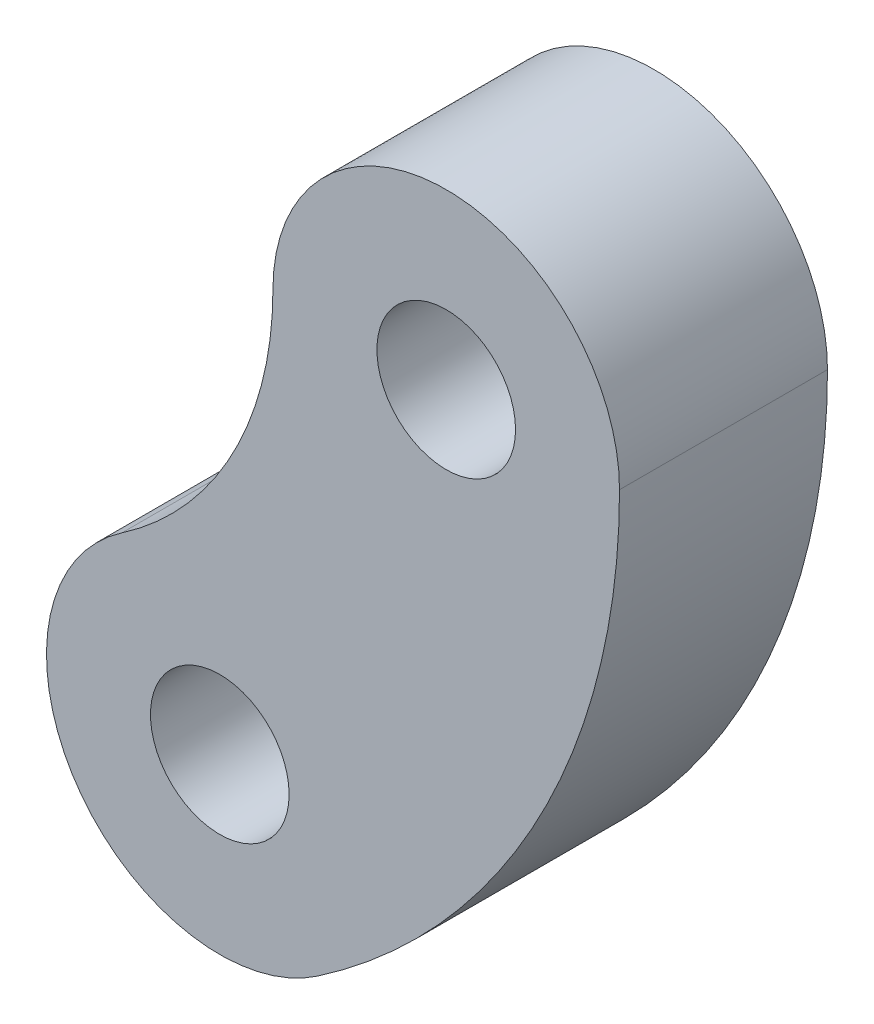
ISO-10303-21;
HEADER;
FILE_DESCRIPTION(('STEP AP214'),'2;1');
FILE_NAME('part.step','',(''),(''),'','','');
FILE_SCHEMA(('AUTOMOTIVE_DESIGN { 1 0 10303 214 1 1 1 1 }'));
ENDSEC;
DATA;
#1=APPLICATION_CONTEXT('core data for automotive mechanical design processes');
#2=APPLICATION_PROTOCOL_DEFINITION('international standard','automotive_design',2000,#1);
#3=PRODUCT_CONTEXT('',#1,'mechanical');
#4=PRODUCT('Part','Part','',(#3));
#5=PRODUCT_RELATED_PRODUCT_CATEGORY('part','',(#4));
#6=PRODUCT_DEFINITION_FORMATION('','',#4);
#7=PRODUCT_DEFINITION_CONTEXT('part definition',#1,'design');
#8=PRODUCT_DEFINITION('design','',#6,#7);
#9=PRODUCT_DEFINITION_SHAPE('','',#8);
#10=(LENGTH_UNIT() NAMED_UNIT(*) SI_UNIT(.MILLI.,.METRE.));
#11=(NAMED_UNIT(*) PLANE_ANGLE_UNIT() SI_UNIT($,.RADIAN.));
#12=(NAMED_UNIT(*) SI_UNIT($,.STERADIAN.) SOLID_ANGLE_UNIT());
#13=UNCERTAINTY_MEASURE_WITH_UNIT(LENGTH_MEASURE(1.E-05),#10,'distance_accuracy_value','');
#14=(GEOMETRIC_REPRESENTATION_CONTEXT(3) GLOBAL_UNCERTAINTY_ASSIGNED_CONTEXT((#13)) GLOBAL_UNIT_ASSIGNED_CONTEXT((#10,
#11,#12)) REPRESENTATION_CONTEXT('',''));
#15=CARTESIAN_POINT('',(0.,0.,0.));
#16=DIRECTION('',(0.,0.,1.));
#17=DIRECTION('',(1.,0.,0.));
#18=AXIS2_PLACEMENT_3D('',#15,#16,#17);
#19=CARTESIAN_POINT('',(3.75,0.,1.5));
#20=DIRECTION('',(0.,0.,1.));
#21=DIRECTION('',(1.,0.,0.));
#22=AXIS2_PLACEMENT_3D('',#19,#20,#21);
#23=PLANE('',#22);
#24=CARTESIAN_POINT('',(4.23333333333333,-6.19103294199675,1.5));
#25=DIRECTION('',(0.,0.,1.));
#26=DIRECTION('',(1.,0.,0.));
#27=AXIS2_PLACEMENT_3D('',#24,#25,#26);
#28=CIRCLE('',#27,1.);
#29=CARTESIAN_POINT('',(5.23333333333333,-6.19103294199675,1.5));
#30=VERTEX_POINT('',#29);
#31=EDGE_CURVE('E100',#30,#30,#28,.T.);
#32=ORIENTED_EDGE('',*,*,#31,.F.);
#33=EDGE_LOOP('',(#32));
#34=FACE_BOUND('',#33,.T.);
#35=CARTESIAN_POINT('',(7.5,0.,1.5));
#36=DIRECTION('',(0.,0.,1.));
#37=DIRECTION('',(1.,0.,0.));
#38=AXIS2_PLACEMENT_3D('',#35,#36,#37);
#39=CIRCLE('',#38,2.5);
#40=CARTESIAN_POINT('',(10.,0.,1.5));
#41=VERTEX_POINT('',#40);
#42=CARTESIAN_POINT('',(5.,0.,1.5));
#43=VERTEX_POINT('',#42);
#44=EDGE_CURVE('E85',#41,#43,#39,.T.);
#45=ORIENTED_EDGE('',*,*,#44,.T.);
#46=CARTESIAN_POINT('',(0.,0.,1.5));
#47=DIRECTION('',(0.,0.,-1.));
#48=DIRECTION('',(1.,0.,0.));
#49=AXIS2_PLACEMENT_3D('',#46,#47,#48);
#50=CIRCLE('',#49,5.);
#51=CARTESIAN_POINT('',(2.82222222222222,-4.1273552946645,1.5));
#52=VERTEX_POINT('',#51);
#53=EDGE_CURVE('E80',#43,#52,#50,.T.);
#54=ORIENTED_EDGE('',*,*,#53,.T.);
#55=CARTESIAN_POINT('',(4.23333333333333,-6.19103294199675,1.5));
#56=DIRECTION('',(0.,0.,1.));
#57=DIRECTION('',(1.,0.,0.));
#58=AXIS2_PLACEMENT_3D('',#55,#56,#57);
#59=CIRCLE('',#58,2.5);
#60=CARTESIAN_POINT('',(5.64444444444445,-8.25471058932899,1.5));
#61=VERTEX_POINT('',#60);
#62=EDGE_CURVE('E83',#52,#61,#59,.T.);
#63=ORIENTED_EDGE('',*,*,#62,.T.);
#64=CARTESIAN_POINT('',(0.,0.,1.5));
#65=DIRECTION('',(0.,0.,1.));
#66=DIRECTION('',(1.,0.,0.));
#67=AXIS2_PLACEMENT_3D('',#64,#65,#66);
#68=CIRCLE('',#67,10.);
#69=EDGE_CURVE('E50',#61,#41,#68,.T.);
#70=ORIENTED_EDGE('',*,*,#69,.T.);
#71=EDGE_LOOP('',(#45,#54,#63,#70));
#72=FACE_BOUND('',#71,.T.);
#73=CARTESIAN_POINT('',(7.5,0.,1.5));
#74=DIRECTION('',(0.,0.,1.));
#75=DIRECTION('',(1.,0.,0.));
#76=AXIS2_PLACEMENT_3D('',#73,#74,#75);
#77=CIRCLE('',#76,1.);
#78=CARTESIAN_POINT('',(8.5,0.,1.5));
#79=VERTEX_POINT('',#78);
#80=EDGE_CURVE('E115',#79,#79,#77,.T.);
#81=ORIENTED_EDGE('',*,*,#80,.F.);
#82=EDGE_LOOP('',(#81));
#83=FACE_BOUND('',#82,.T.);
#84=ADVANCED_FACE('F33',(#34,#72,#83),#23,.T.);
#85=CARTESIAN_POINT('',(3.75,0.,-1.5));
#86=DIRECTION('',(0.,0.,1.));
#87=DIRECTION('',(1.,0.,0.));
#88=AXIS2_PLACEMENT_3D('',#85,#86,#87);
#89=PLANE('',#88);
#90=CARTESIAN_POINT('',(7.5,0.,-1.5));
#91=DIRECTION('',(0.,0.,1.));
#92=DIRECTION('',(1.,0.,0.));
#93=AXIS2_PLACEMENT_3D('',#90,#91,#92);
#94=CIRCLE('',#93,2.5);
#95=CARTESIAN_POINT('',(10.,0.,-1.5));
#96=VERTEX_POINT('',#95);
#97=CARTESIAN_POINT('',(5.,0.,-1.5));
#98=VERTEX_POINT('',#97);
#99=EDGE_CURVE('E97',#96,#98,#94,.T.);
#100=ORIENTED_EDGE('',*,*,#99,.F.);
#101=CARTESIAN_POINT('',(0.,0.,-1.5));
#102=DIRECTION('',(0.,0.,1.));
#103=DIRECTION('',(1.,0.,0.));
#104=AXIS2_PLACEMENT_3D('',#101,#102,#103);
#105=CIRCLE('',#104,10.);
#106=CARTESIAN_POINT('',(5.64444444444445,-8.25471058932899,-1.5));
#107=VERTEX_POINT('',#106);
#108=EDGE_CURVE('E73',#107,#96,#105,.T.);
#109=ORIENTED_EDGE('',*,*,#108,.F.);
#110=CARTESIAN_POINT('',(4.23333333333333,-6.19103294199675,-1.5));
#111=DIRECTION('',(0.,0.,1.));
#112=DIRECTION('',(1.,0.,0.));
#113=AXIS2_PLACEMENT_3D('',#110,#111,#112);
#114=CIRCLE('',#113,2.5);
#115=CARTESIAN_POINT('',(2.82222222222222,-4.1273552946645,-1.5));
#116=VERTEX_POINT('',#115);
#117=EDGE_CURVE('E67',#116,#107,#114,.T.);
#118=ORIENTED_EDGE('',*,*,#117,.F.);
#119=CARTESIAN_POINT('',(0.,0.,-1.5));
#120=DIRECTION('',(0.,0.,-1.));
#121=DIRECTION('',(1.,0.,0.));
#122=AXIS2_PLACEMENT_3D('',#119,#120,#121);
#123=CIRCLE('',#122,5.);
#124=EDGE_CURVE('E89',#98,#116,#123,.T.);
#125=ORIENTED_EDGE('',*,*,#124,.F.);
#126=EDGE_LOOP('',(#100,#109,#118,#125));
#127=FACE_BOUND('',#126,.T.);
#128=CARTESIAN_POINT('',(4.23333333333333,-6.19103294199675,-1.5));
#129=DIRECTION('',(0.,0.,1.));
#130=DIRECTION('',(1.,0.,0.));
#131=AXIS2_PLACEMENT_3D('',#128,#129,#130);
#132=CIRCLE('',#131,1.);
#133=CARTESIAN_POINT('',(5.23333333333333,-6.19103294199675,-1.5));
#134=VERTEX_POINT('',#133);
#135=EDGE_CURVE('E112',#134,#134,#132,.T.);
#136=ORIENTED_EDGE('',*,*,#135,.T.);
#137=EDGE_LOOP('',(#136));
#138=FACE_BOUND('',#137,.T.);
#139=CARTESIAN_POINT('',(7.5,0.,-1.5));
#140=DIRECTION('',(0.,0.,1.));
#141=DIRECTION('',(1.,0.,0.));
#142=AXIS2_PLACEMENT_3D('',#139,#140,#141);
#143=CIRCLE('',#142,1.);
#144=CARTESIAN_POINT('',(8.5,0.,-1.5));
#145=VERTEX_POINT('',#144);
#146=EDGE_CURVE('E118',#145,#145,#143,.T.);
#147=ORIENTED_EDGE('',*,*,#146,.T.);
#148=EDGE_LOOP('',(#147));
#149=FACE_BOUND('',#148,.T.);
#150=ADVANCED_FACE('F108',(#127,#138,#149),#89,.F.);
#151=CARTESIAN_POINT('',(7.5,0.,1.5));
#152=DIRECTION('',(0.,0.,-1.));
#153=DIRECTION('',(-1.,0.,0.));
#154=AXIS2_PLACEMENT_3D('',#151,#152,#153);
#155=CYLINDRICAL_SURFACE('',#154,2.5);
#156=ORIENTED_EDGE('',*,*,#99,.T.);
#157=DIRECTION('',(0.,0.,-1.));
#158=VECTOR('',#157,1.);
#159=CARTESIAN_POINT('',(5.,0.,1.5));
#160=LINE('',#159,#158);
#161=EDGE_CURVE('E11',#43,#98,#160,.T.);
#162=ORIENTED_EDGE('',*,*,#161,.F.);
#163=ORIENTED_EDGE('',*,*,#44,.F.);
#164=DIRECTION('',(0.,0.,-1.));
#165=VECTOR('',#164,1.);
#166=CARTESIAN_POINT('',(10.,0.,1.5));
#167=LINE('',#166,#165);
#168=EDGE_CURVE('E93',#41,#96,#167,.T.);
#169=ORIENTED_EDGE('',*,*,#168,.T.);
#170=EDGE_LOOP('',(#156,#162,#163,#169));
#171=FACE_BOUND('',#170,.T.);
#172=ADVANCED_FACE('F35',(#171),#155,.T.);
#173=CARTESIAN_POINT('',(0.,0.,1.5));
#174=DIRECTION('',(0.,0.,-1.));
#175=DIRECTION('',(-1.,0.,0.));
#176=AXIS2_PLACEMENT_3D('',#173,#174,#175);
#177=CYLINDRICAL_SURFACE('',#176,5.);
#178=ORIENTED_EDGE('',*,*,#124,.T.);
#179=DIRECTION('',(0.,0.,-1.));
#180=VECTOR('',#179,1.);
#181=CARTESIAN_POINT('',(2.82222222222222,-4.1273552946645,1.5));
#182=LINE('',#181,#180);
#183=EDGE_CURVE('E42',#52,#116,#182,.T.);
#184=ORIENTED_EDGE('',*,*,#183,.F.);
#185=ORIENTED_EDGE('',*,*,#53,.F.);
#186=ORIENTED_EDGE('',*,*,#161,.T.);
#187=EDGE_LOOP('',(#178,#184,#185,#186));
#188=FACE_BOUND('',#187,.T.);
#189=ADVANCED_FACE('F88',(#188),#177,.F.);
#190=CARTESIAN_POINT('',(4.23333333333333,-6.19103294199675,1.5));
#191=DIRECTION('',(0.,0.,-1.));
#192=DIRECTION('',(-1.,0.,0.));
#193=AXIS2_PLACEMENT_3D('',#190,#191,#192);
#194=CYLINDRICAL_SURFACE('',#193,2.5);
#195=ORIENTED_EDGE('',*,*,#117,.T.);
#196=DIRECTION('',(0.,0.,-1.));
#197=VECTOR('',#196,1.);
#198=CARTESIAN_POINT('',(5.64444444444445,-8.25471058932899,1.5));
#199=LINE('',#198,#197);
#200=EDGE_CURVE('E90',#61,#107,#199,.T.);
#201=ORIENTED_EDGE('',*,*,#200,.F.);
#202=ORIENTED_EDGE('',*,*,#62,.F.);
#203=ORIENTED_EDGE('',*,*,#183,.T.);
#204=EDGE_LOOP('',(#195,#201,#202,#203));
#205=FACE_BOUND('',#204,.T.);
#206=ADVANCED_FACE('F91',(#205),#194,.T.);
#207=CARTESIAN_POINT('',(0.,0.,1.5));
#208=DIRECTION('',(0.,0.,-1.));
#209=DIRECTION('',(-1.,0.,0.));
#210=AXIS2_PLACEMENT_3D('',#207,#208,#209);
#211=CYLINDRICAL_SURFACE('',#210,10.);
#212=ORIENTED_EDGE('',*,*,#108,.T.);
#213=ORIENTED_EDGE('',*,*,#168,.F.);
#214=ORIENTED_EDGE('',*,*,#69,.F.);
#215=ORIENTED_EDGE('',*,*,#200,.T.);
#216=EDGE_LOOP('',(#212,#213,#214,#215));
#217=FACE_BOUND('',#216,.T.);
#218=ADVANCED_FACE('F105',(#217),#211,.T.);
#219=CARTESIAN_POINT('',(4.23333333333333,-6.19103294199675,1.5));
#220=DIRECTION('',(0.,0.,-1.));
#221=DIRECTION('',(-1.,0.,0.));
#222=AXIS2_PLACEMENT_3D('',#219,#220,#221);
#223=CYLINDRICAL_SURFACE('',#222,1.);
#224=ORIENTED_EDGE('',*,*,#31,.T.);
#225=EDGE_LOOP('',(#224));
#226=FACE_BOUND('',#225,.T.);
#227=ORIENTED_EDGE('',*,*,#135,.F.);
#228=EDGE_LOOP('',(#227));
#229=FACE_BOUND('',#228,.T.);
#230=ADVANCED_FACE('F135',(#226,#229),#223,.F.);
#231=CARTESIAN_POINT('',(7.5,0.,1.5));
#232=DIRECTION('',(0.,0.,-1.));
#233=DIRECTION('',(-1.,0.,0.));
#234=AXIS2_PLACEMENT_3D('',#231,#232,#233);
#235=CYLINDRICAL_SURFACE('',#234,1.);
#236=ORIENTED_EDGE('',*,*,#80,.T.);
#237=EDGE_LOOP('',(#236));
#238=FACE_BOUND('',#237,.T.);
#239=ORIENTED_EDGE('',*,*,#146,.F.);
#240=EDGE_LOOP('',(#239));
#241=FACE_BOUND('',#240,.T.);
#242=ADVANCED_FACE('F124',(#238,#241),#235,.F.);
#243=CLOSED_SHELL('',(#84,#150,#172,#189,#206,#218,#230,#242));
#244=MANIFOLD_SOLID_BREP('B2',#243);
#245=ADVANCED_BREP_SHAPE_REPRESENTATION('',(#18,#244),#14);
#246=SHAPE_DEFINITION_REPRESENTATION(#9,#245);
ENDSEC;
END-ISO-10303-21;
